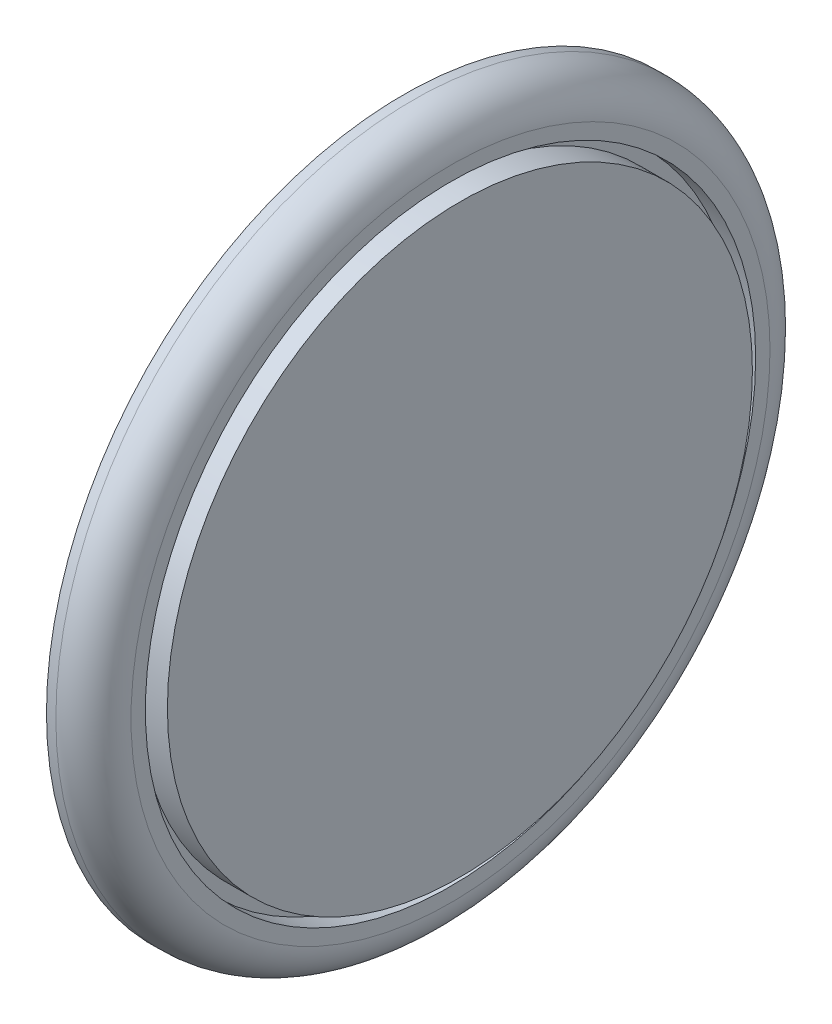
ISO-10303-21;
HEADER;
FILE_DESCRIPTION(('STEP AP214'),'2;1');
FILE_NAME('part.step','',(''),(''),'','','');
FILE_SCHEMA(('AUTOMOTIVE_DESIGN { 1 0 10303 214 1 1 1 1 }'));
ENDSEC;
DATA;
#1=APPLICATION_CONTEXT('core data for automotive mechanical design processes');
#2=APPLICATION_PROTOCOL_DEFINITION('international standard','automotive_design',2000,#1);
#3=PRODUCT_CONTEXT('',#1,'mechanical');
#4=PRODUCT('Part','Part','',(#3));
#5=PRODUCT_RELATED_PRODUCT_CATEGORY('part','',(#4));
#6=PRODUCT_DEFINITION_FORMATION('','',#4);
#7=PRODUCT_DEFINITION_CONTEXT('part definition',#1,'design');
#8=PRODUCT_DEFINITION('design','',#6,#7);
#9=PRODUCT_DEFINITION_SHAPE('','',#8);
#10=(LENGTH_UNIT() NAMED_UNIT(*) SI_UNIT(.MILLI.,.METRE.));
#11=(NAMED_UNIT(*) PLANE_ANGLE_UNIT() SI_UNIT($,.RADIAN.));
#12=(NAMED_UNIT(*) SI_UNIT($,.STERADIAN.) SOLID_ANGLE_UNIT());
#13=UNCERTAINTY_MEASURE_WITH_UNIT(LENGTH_MEASURE(1.E-05),#10,'distance_accuracy_value','');
#14=(GEOMETRIC_REPRESENTATION_CONTEXT(3) GLOBAL_UNCERTAINTY_ASSIGNED_CONTEXT((#13)) GLOBAL_UNIT_ASSIGNED_CONTEXT((#10,
#11,#12)) REPRESENTATION_CONTEXT('',''));
#15=CARTESIAN_POINT('',(0.,0.,0.));
#16=DIRECTION('',(0.,0.,1.));
#17=DIRECTION('',(1.,0.,0.));
#18=AXIS2_PLACEMENT_3D('',#15,#16,#17);
#19=CARTESIAN_POINT('',(5.,0.,0.));
#20=DIRECTION('',(-1.,0.,0.));
#21=DIRECTION('',(0.,0.,1.));
#22=AXIS2_PLACEMENT_3D('',#19,#20,#21);
#23=CYLINDRICAL_SURFACE('',#22,38.);
#24=CARTESIAN_POINT('',(1.,0.,0.));
#25=DIRECTION('',(1.,0.,0.));
#26=DIRECTION('',(0.,0.,-1.));
#27=AXIS2_PLACEMENT_3D('',#24,#25,#26);
#28=CIRCLE('',#27,38.);
#29=CARTESIAN_POINT('',(1.,0.,-38.));
#30=VERTEX_POINT('',#29);
#31=EDGE_CURVE('E64',#30,#30,#28,.F.);
#32=ORIENTED_EDGE('',*,*,#31,.T.);
#33=EDGE_LOOP('',(#32));
#34=FACE_BOUND('',#33,.T.);
#35=CARTESIAN_POINT('',(0.,0.,0.));
#36=DIRECTION('',(1.,0.,0.));
#37=DIRECTION('',(0.,0.,-1.));
#38=AXIS2_PLACEMENT_3D('',#35,#36,#37);
#39=CIRCLE('',#38,38.);
#40=CARTESIAN_POINT('',(0.,0.,-38.));
#41=VERTEX_POINT('',#40);
#42=EDGE_CURVE('E70',#41,#41,#39,.T.);
#43=ORIENTED_EDGE('',*,*,#42,.T.);
#44=EDGE_LOOP('',(#43));
#45=FACE_BOUND('',#44,.T.);
#46=ADVANCED_FACE('F41',(#34,#45),#23,.T.);
#47=CARTESIAN_POINT('',(5.,0.,0.));
#48=DIRECTION('',(1.,0.,0.));
#49=DIRECTION('',(0.,0.,-1.));
#50=AXIS2_PLACEMENT_3D('',#47,#48,#49);
#51=PLANE('',#50);
#52=CARTESIAN_POINT('',(5.,0.,0.));
#53=DIRECTION('',(1.,0.,0.));
#54=DIRECTION('',(0.,0.,-1.));
#55=AXIS2_PLACEMENT_3D('',#52,#53,#54);
#56=CIRCLE('',#55,32.4744734252896);
#57=CARTESIAN_POINT('',(5.,0.,-32.4744734252896));
#58=VERTEX_POINT('',#57);
#59=EDGE_CURVE('E89',#58,#58,#56,.T.);
#60=ORIENTED_EDGE('',*,*,#59,.F.);
#61=EDGE_LOOP('',(#60));
#62=FACE_BOUND('',#61,.T.);
#63=CARTESIAN_POINT('',(5.,0.,0.));
#64=DIRECTION('',(1.,0.,0.));
#65=DIRECTION('',(0.,0.,-1.));
#66=AXIS2_PLACEMENT_3D('',#63,#64,#65);
#67=CIRCLE('',#66,34.);
#68=CARTESIAN_POINT('',(5.,0.,-34.));
#69=VERTEX_POINT('',#68);
#70=EDGE_CURVE('E67',#69,#69,#67,.T.);
#71=ORIENTED_EDGE('',*,*,#70,.T.);
#72=EDGE_LOOP('',(#71));
#73=FACE_BOUND('',#72,.T.);
#74=ADVANCED_FACE('F135',(#62,#73),#51,.T.);
#75=CARTESIAN_POINT('',(0.,0.,0.));
#76=DIRECTION('',(1.,0.,0.));
#77=DIRECTION('',(0.,0.,-1.));
#78=AXIS2_PLACEMENT_3D('',#75,#76,#77);
#79=PLANE('',#78);
#80=CARTESIAN_POINT('',(0.,0.,0.));
#81=DIRECTION('',(-1.,0.,0.));
#82=DIRECTION('',(0.,0.,1.));
#83=AXIS2_PLACEMENT_3D('',#80,#81,#82);
#84=CIRCLE('',#83,35.1916978171089);
#85=CARTESIAN_POINT('',(0.,0.,35.1916978171089));
#86=VERTEX_POINT('',#85);
#87=EDGE_CURVE('E95',#86,#86,#84,.T.);
#88=ORIENTED_EDGE('',*,*,#87,.F.);
#89=EDGE_LOOP('',(#88));
#90=FACE_BOUND('',#89,.T.);
#91=ORIENTED_EDGE('',*,*,#42,.F.);
#92=EDGE_LOOP('',(#91));
#93=FACE_BOUND('',#92,.T.);
#94=ADVANCED_FACE('F138',(#90,#93),#79,.F.);
#95=CARTESIAN_POINT('',(1.,0.,0.));
#96=DIRECTION('',(1.,0.,0.));
#97=DIRECTION('',(0.,0.,-1.));
#98=AXIS2_PLACEMENT_3D('',#95,#96,#97);
#99=TOROIDAL_SURFACE('',#98,34.,4.);
#100=ORIENTED_EDGE('',*,*,#31,.F.);
#101=EDGE_LOOP('',(#100));
#102=FACE_BOUND('',#101,.T.);
#103=ORIENTED_EDGE('',*,*,#70,.F.);
#104=EDGE_LOOP('',(#103));
#105=FACE_BOUND('',#104,.T.);
#106=ADVANCED_FACE('F43',(#102,#105),#99,.T.);
#107=CARTESIAN_POINT('',(3.,0.,0.));
#108=DIRECTION('',(1.,0.,0.));
#109=DIRECTION('',(0.,0.,-1.));
#110=AXIS2_PLACEMENT_3D('',#107,#108,#109);
#111=CYLINDRICAL_SURFACE('',#110,32.4744734252896);
#112=CARTESIAN_POINT('',(3.,0.,0.));
#113=DIRECTION('',(1.,0.,0.));
#114=DIRECTION('',(0.,0.,-1.));
#115=AXIS2_PLACEMENT_3D('',#112,#113,#114);
#116=CIRCLE('',#115,32.4744734252896);
#117=CARTESIAN_POINT('',(3.,0.,-32.4744734252896));
#118=VERTEX_POINT('',#117);
#119=EDGE_CURVE('E88',#118,#118,#116,.T.);
#120=ORIENTED_EDGE('',*,*,#119,.F.);
#121=EDGE_LOOP('',(#120));
#122=FACE_BOUND('',#121,.T.);
#123=ORIENTED_EDGE('',*,*,#59,.T.);
#124=EDGE_LOOP('',(#123));
#125=FACE_BOUND('',#124,.T.);
#126=ADVANCED_FACE('F126',(#122,#125),#111,.F.);
#127=CARTESIAN_POINT('',(3.,0.,0.));
#128=DIRECTION('',(1.,0.,0.));
#129=DIRECTION('',(0.,0.,-1.));
#130=AXIS2_PLACEMENT_3D('',#127,#128,#129);
#131=PLANE('',#130);
#132=CARTESIAN_POINT('',(3.,0.,0.));
#133=DIRECTION('',(1.,0.,0.));
#134=DIRECTION('',(0.,0.,-1.));
#135=AXIS2_PLACEMENT_3D('',#132,#133,#134);
#136=CIRCLE('',#135,31.1285855775368);
#137=CARTESIAN_POINT('',(3.,0.,-31.1285855775368));
#138=VERTEX_POINT('',#137);
#139=EDGE_CURVE('E107',#138,#138,#136,.T.);
#140=ORIENTED_EDGE('',*,*,#139,.F.);
#141=EDGE_LOOP('',(#140));
#142=FACE_BOUND('',#141,.T.);
#143=ORIENTED_EDGE('',*,*,#119,.T.);
#144=EDGE_LOOP('',(#143));
#145=FACE_BOUND('',#144,.T.);
#146=ADVANCED_FACE('F122',(#142,#145),#131,.T.);
#147=CARTESIAN_POINT('',(2.,0.,0.));
#148=DIRECTION('',(-1.,0.,0.));
#149=DIRECTION('',(0.,0.,1.));
#150=AXIS2_PLACEMENT_3D('',#147,#148,#149);
#151=CYLINDRICAL_SURFACE('',#150,35.1916978171089);
#152=CARTESIAN_POINT('',(2.,0.,0.));
#153=DIRECTION('',(-1.,0.,0.));
#154=DIRECTION('',(0.,0.,1.));
#155=AXIS2_PLACEMENT_3D('',#152,#153,#154);
#156=CIRCLE('',#155,35.1916978171089);
#157=CARTESIAN_POINT('',(2.,0.,35.1916978171089));
#158=VERTEX_POINT('',#157);
#159=EDGE_CURVE('E92',#158,#158,#156,.T.);
#160=ORIENTED_EDGE('',*,*,#159,.F.);
#161=EDGE_LOOP('',(#160));
#162=FACE_BOUND('',#161,.T.);
#163=ORIENTED_EDGE('',*,*,#87,.T.);
#164=EDGE_LOOP('',(#163));
#165=FACE_BOUND('',#164,.T.);
#166=ADVANCED_FACE('F125',(#162,#165),#151,.F.);
#167=CARTESIAN_POINT('',(2.,0.,0.));
#168=DIRECTION('',(-1.,0.,0.));
#169=DIRECTION('',(0.,0.,1.));
#170=AXIS2_PLACEMENT_3D('',#167,#168,#169);
#171=PLANE('',#170);
#172=CARTESIAN_POINT('',(2.,0.,0.));
#173=DIRECTION('',(-1.,0.,0.));
#174=DIRECTION('',(0.,0.,1.));
#175=AXIS2_PLACEMENT_3D('',#172,#173,#174);
#176=CIRCLE('',#175,32.740433986256);
#177=CARTESIAN_POINT('',(2.,0.,32.740433986256));
#178=VERTEX_POINT('',#177);
#179=EDGE_CURVE('E98',#178,#178,#176,.T.);
#180=ORIENTED_EDGE('',*,*,#179,.F.);
#181=EDGE_LOOP('',(#180));
#182=FACE_BOUND('',#181,.T.);
#183=ORIENTED_EDGE('',*,*,#159,.T.);
#184=EDGE_LOOP('',(#183));
#185=FACE_BOUND('',#184,.T.);
#186=ADVANCED_FACE('F200',(#182,#185),#171,.T.);
#187=CARTESIAN_POINT('',(2.,0.,0.));
#188=DIRECTION('',(-1.,0.,0.));
#189=DIRECTION('',(0.,0.,1.));
#190=AXIS2_PLACEMENT_3D('',#187,#188,#189);
#191=CYLINDRICAL_SURFACE('',#190,32.740433986256);
#192=ORIENTED_EDGE('',*,*,#179,.T.);
#193=EDGE_LOOP('',(#192));
#194=FACE_BOUND('',#193,.T.);
#195=CARTESIAN_POINT('',(0.,0.,0.));
#196=DIRECTION('',(-1.,0.,0.));
#197=DIRECTION('',(0.,0.,1.));
#198=AXIS2_PLACEMENT_3D('',#195,#196,#197);
#199=CIRCLE('',#198,32.740433986256);
#200=CARTESIAN_POINT('',(0.,0.,32.740433986256));
#201=VERTEX_POINT('',#200);
#202=EDGE_CURVE('E101',#201,#201,#199,.T.);
#203=ORIENTED_EDGE('',*,*,#202,.F.);
#204=EDGE_LOOP('',(#203));
#205=FACE_BOUND('',#204,.T.);
#206=ADVANCED_FACE('F195',(#194,#205),#191,.T.);
#207=CARTESIAN_POINT('',(-2.3,-16.29,0.));
#208=DIRECTION('',(1.,0.,0.));
#209=DIRECTION('',(0.,0.,-1.));
#210=AXIS2_PLACEMENT_3D('',#207,#208,#209);
#211=PLANE('',#210);
#212=CARTESIAN_POINT('',(-2.3,-16.29,0.));
#213=DIRECTION('',(-1.,0.,0.));
#214=DIRECTION('',(0.,0.,-1.));
#215=AXIS2_PLACEMENT_3D('',#212,#213,#214);
#216=CIRCLE('',#215,2.);
#217=CARTESIAN_POINT('',(-2.3,-16.29,-2.));
#218=VERTEX_POINT('',#217);
#219=EDGE_CURVE('E85',#218,#218,#216,.T.);
#220=ORIENTED_EDGE('',*,*,#219,.T.);
#221=EDGE_LOOP('',(#220));
#222=FACE_BOUND('',#221,.T.);
#223=ADVANCED_FACE('F189',(#222),#211,.F.);
#224=CARTESIAN_POINT('',(-2.3,0.,-16.29));
#225=DIRECTION('',(1.,0.,0.));
#226=DIRECTION('',(0.,0.,-1.));
#227=AXIS2_PLACEMENT_3D('',#224,#225,#226);
#228=PLANE('',#227);
#229=CARTESIAN_POINT('',(-2.3,0.,-16.29));
#230=DIRECTION('',(-1.,0.,0.));
#231=DIRECTION('',(0.,0.,-1.));
#232=AXIS2_PLACEMENT_3D('',#229,#230,#231);
#233=CIRCLE('',#232,2.);
#234=CARTESIAN_POINT('',(-2.3,0.,-18.29));
#235=VERTEX_POINT('',#234);
#236=EDGE_CURVE('E82',#235,#235,#233,.T.);
#237=ORIENTED_EDGE('',*,*,#236,.T.);
#238=EDGE_LOOP('',(#237));
#239=FACE_BOUND('',#238,.T.);
#240=ADVANCED_FACE('F182',(#239),#228,.F.);
#241=CARTESIAN_POINT('',(-2.3,16.29,0.));
#242=DIRECTION('',(-1.,0.,0.));
#243=DIRECTION('',(0.,0.,1.));
#244=AXIS2_PLACEMENT_3D('',#241,#242,#243);
#245=PLANE('',#244);
#246=CARTESIAN_POINT('',(-2.3,16.29,0.));
#247=DIRECTION('',(-1.,0.,0.));
#248=DIRECTION('',(0.,0.,1.));
#249=AXIS2_PLACEMENT_3D('',#246,#247,#248);
#250=CIRCLE('',#249,2.);
#251=CARTESIAN_POINT('',(-2.3,16.29,2.));
#252=VERTEX_POINT('',#251);
#253=EDGE_CURVE('E79',#252,#252,#250,.T.);
#254=ORIENTED_EDGE('',*,*,#253,.T.);
#255=EDGE_LOOP('',(#254));
#256=FACE_BOUND('',#255,.T.);
#257=ADVANCED_FACE('F174',(#256),#245,.T.);
#258=CARTESIAN_POINT('',(-2.3,0.,16.29));
#259=DIRECTION('',(-1.,0.,0.));
#260=DIRECTION('',(0.,0.,1.));
#261=AXIS2_PLACEMENT_3D('',#258,#259,#260);
#262=PLANE('',#261);
#263=CARTESIAN_POINT('',(-2.3,0.,16.29));
#264=DIRECTION('',(-1.,0.,0.));
#265=DIRECTION('',(0.,0.,1.));
#266=AXIS2_PLACEMENT_3D('',#263,#264,#265);
#267=CIRCLE('',#266,2.);
#268=CARTESIAN_POINT('',(-2.3,0.,18.29));
#269=VERTEX_POINT('',#268);
#270=EDGE_CURVE('E76',#269,#269,#267,.T.);
#271=ORIENTED_EDGE('',*,*,#270,.T.);
#272=EDGE_LOOP('',(#271));
#273=FACE_BOUND('',#272,.T.);
#274=ADVANCED_FACE('F166',(#273),#262,.T.);
#275=CARTESIAN_POINT('',(-2.3,0.,0.));
#276=DIRECTION('',(-1.,0.,0.));
#277=DIRECTION('',(0.,0.,1.));
#278=AXIS2_PLACEMENT_3D('',#275,#276,#277);
#279=PLANE('',#278);
#280=CARTESIAN_POINT('',(-2.3,0.,0.));
#281=DIRECTION('',(-1.,0.,0.));
#282=DIRECTION('',(0.,0.,1.));
#283=AXIS2_PLACEMENT_3D('',#280,#281,#282);
#284=CIRCLE('',#283,2.);
#285=CARTESIAN_POINT('',(-2.3,0.,2.));
#286=VERTEX_POINT('',#285);
#287=EDGE_CURVE('E73',#286,#286,#284,.T.);
#288=ORIENTED_EDGE('',*,*,#287,.T.);
#289=EDGE_LOOP('',(#288));
#290=FACE_BOUND('',#289,.T.);
#291=ADVANCED_FACE('F162',(#290),#279,.T.);
#292=CARTESIAN_POINT('',(-2.3,-16.29,0.));
#293=DIRECTION('',(1.,0.,0.));
#294=DIRECTION('',(0.,0.,-1.));
#295=AXIS2_PLACEMENT_3D('',#292,#293,#294);
#296=CYLINDRICAL_SURFACE('',#295,2.);
#297=ORIENTED_EDGE('',*,*,#219,.F.);
#298=EDGE_LOOP('',(#297));
#299=FACE_BOUND('',#298,.T.);
#300=CARTESIAN_POINT('',(0.,-16.29,0.));
#301=DIRECTION('',(1.,0.,0.));
#302=DIRECTION('',(0.,0.,-1.));
#303=AXIS2_PLACEMENT_3D('',#300,#301,#302);
#304=CIRCLE('',#303,2.);
#305=CARTESIAN_POINT('',(0.,-16.29,-2.));
#306=VERTEX_POINT('',#305);
#307=EDGE_CURVE('E10',#306,#306,#304,.F.);
#308=ORIENTED_EDGE('',*,*,#307,.T.);
#309=EDGE_LOOP('',(#308));
#310=FACE_BOUND('',#309,.T.);
#311=ADVANCED_FACE('F165',(#299,#310),#296,.T.);
#312=CARTESIAN_POINT('',(-2.3,0.,-16.29));
#313=DIRECTION('',(1.,0.,0.));
#314=DIRECTION('',(0.,0.,-1.));
#315=AXIS2_PLACEMENT_3D('',#312,#313,#314);
#316=CYLINDRICAL_SURFACE('',#315,2.);
#317=ORIENTED_EDGE('',*,*,#236,.F.);
#318=EDGE_LOOP('',(#317));
#319=FACE_BOUND('',#318,.T.);
#320=CARTESIAN_POINT('',(0.,0.,-16.29));
#321=DIRECTION('',(1.,0.,0.));
#322=DIRECTION('',(0.,0.,-1.));
#323=AXIS2_PLACEMENT_3D('',#320,#321,#322);
#324=CIRCLE('',#323,2.);
#325=CARTESIAN_POINT('',(0.,0.,-18.29));
#326=VERTEX_POINT('',#325);
#327=EDGE_CURVE('E48',#326,#326,#324,.F.);
#328=ORIENTED_EDGE('',*,*,#327,.T.);
#329=EDGE_LOOP('',(#328));
#330=FACE_BOUND('',#329,.T.);
#331=ADVANCED_FACE('F178',(#319,#330),#316,.T.);
#332=CARTESIAN_POINT('',(-2.3,16.29,0.));
#333=DIRECTION('',(1.,0.,0.));
#334=DIRECTION('',(0.,0.,-1.));
#335=AXIS2_PLACEMENT_3D('',#332,#333,#334);
#336=CYLINDRICAL_SURFACE('',#335,2.);
#337=ORIENTED_EDGE('',*,*,#253,.F.);
#338=EDGE_LOOP('',(#337));
#339=FACE_BOUND('',#338,.T.);
#340=CARTESIAN_POINT('',(0.,16.29,0.));
#341=DIRECTION('',(1.,0.,0.));
#342=DIRECTION('',(0.,0.,-1.));
#343=AXIS2_PLACEMENT_3D('',#340,#341,#342);
#344=CIRCLE('',#343,2.);
#345=CARTESIAN_POINT('',(0.,16.29,-2.));
#346=VERTEX_POINT('',#345);
#347=EDGE_CURVE('E52',#346,#346,#344,.F.);
#348=ORIENTED_EDGE('',*,*,#347,.T.);
#349=EDGE_LOOP('',(#348));
#350=FACE_BOUND('',#349,.T.);
#351=ADVANCED_FACE('F170',(#339,#350),#336,.T.);
#352=CARTESIAN_POINT('',(-2.3,0.,16.29));
#353=DIRECTION('',(1.,0.,0.));
#354=DIRECTION('',(0.,0.,-1.));
#355=AXIS2_PLACEMENT_3D('',#352,#353,#354);
#356=CYLINDRICAL_SURFACE('',#355,2.);
#357=ORIENTED_EDGE('',*,*,#270,.F.);
#358=EDGE_LOOP('',(#357));
#359=FACE_BOUND('',#358,.T.);
#360=CARTESIAN_POINT('',(0.,0.,16.29));
#361=DIRECTION('',(1.,0.,0.));
#362=DIRECTION('',(0.,0.,-1.));
#363=AXIS2_PLACEMENT_3D('',#360,#361,#362);
#364=CIRCLE('',#363,2.);
#365=CARTESIAN_POINT('',(0.,0.,14.29));
#366=VERTEX_POINT('',#365);
#367=EDGE_CURVE('E56',#366,#366,#364,.F.);
#368=ORIENTED_EDGE('',*,*,#367,.T.);
#369=EDGE_LOOP('',(#368));
#370=FACE_BOUND('',#369,.T.);
#371=ADVANCED_FACE('F160',(#359,#370),#356,.T.);
#372=CARTESIAN_POINT('',(-2.3,0.,0.));
#373=DIRECTION('',(1.,0.,0.));
#374=DIRECTION('',(0.,0.,-1.));
#375=AXIS2_PLACEMENT_3D('',#372,#373,#374);
#376=CYLINDRICAL_SURFACE('',#375,2.);
#377=ORIENTED_EDGE('',*,*,#287,.F.);
#378=EDGE_LOOP('',(#377));
#379=FACE_BOUND('',#378,.T.);
#380=CARTESIAN_POINT('',(0.,0.,0.));
#381=DIRECTION('',(1.,0.,0.));
#382=DIRECTION('',(0.,0.,-1.));
#383=AXIS2_PLACEMENT_3D('',#380,#381,#382);
#384=CIRCLE('',#383,2.);
#385=CARTESIAN_POINT('',(0.,0.,-2.));
#386=VERTEX_POINT('',#385);
#387=EDGE_CURVE('E61',#386,#386,#384,.F.);
#388=ORIENTED_EDGE('',*,*,#387,.T.);
#389=EDGE_LOOP('',(#388));
#390=FACE_BOUND('',#389,.T.);
#391=ADVANCED_FACE('F157',(#379,#390),#376,.T.);
#392=ORIENTED_EDGE('',*,*,#387,.F.);
#393=EDGE_LOOP('',(#392));
#394=FACE_BOUND('',#393,.T.);
#395=ORIENTED_EDGE('',*,*,#367,.F.);
#396=EDGE_LOOP('',(#395));
#397=FACE_BOUND('',#396,.T.);
#398=ORIENTED_EDGE('',*,*,#347,.F.);
#399=EDGE_LOOP('',(#398));
#400=FACE_BOUND('',#399,.T.);
#401=ORIENTED_EDGE('',*,*,#327,.F.);
#402=EDGE_LOOP('',(#401));
#403=FACE_BOUND('',#402,.T.);
#404=ORIENTED_EDGE('',*,*,#307,.F.);
#405=EDGE_LOOP('',(#404));
#406=FACE_BOUND('',#405,.T.);
#407=ORIENTED_EDGE('',*,*,#202,.T.);
#408=EDGE_LOOP('',(#407));
#409=FACE_BOUND('',#408,.T.);
#410=ADVANCED_FACE('F118',(#394,#397,#400,#403,#406,#409),#79,.F.);
#411=CARTESIAN_POINT('',(6.,0.,0.));
#412=DIRECTION('',(-1.,0.,0.));
#413=DIRECTION('',(0.,0.,1.));
#414=AXIS2_PLACEMENT_3D('',#411,#412,#413);
#415=CYLINDRICAL_SURFACE('',#414,31.1285855775368);
#416=CARTESIAN_POINT('',(6.,0.,0.));
#417=DIRECTION('',(1.,0.,0.));
#418=DIRECTION('',(0.,0.,-1.));
#419=AXIS2_PLACEMENT_3D('',#416,#417,#418);
#420=CIRCLE('',#419,31.1285855775368);
#421=CARTESIAN_POINT('',(6.,0.,-31.1285855775368));
#422=VERTEX_POINT('',#421);
#423=EDGE_CURVE('E104',#422,#422,#420,.T.);
#424=ORIENTED_EDGE('',*,*,#423,.F.);
#425=EDGE_LOOP('',(#424));
#426=FACE_BOUND('',#425,.T.);
#427=ORIENTED_EDGE('',*,*,#139,.T.);
#428=EDGE_LOOP('',(#427));
#429=FACE_BOUND('',#428,.T.);
#430=ADVANCED_FACE('F115',(#426,#429),#415,.T.);
#431=CARTESIAN_POINT('',(6.,0.,0.));
#432=DIRECTION('',(1.,0.,0.));
#433=DIRECTION('',(0.,0.,-1.));
#434=AXIS2_PLACEMENT_3D('',#431,#432,#433);
#435=PLANE('',#434);
#436=ORIENTED_EDGE('',*,*,#423,.T.);
#437=EDGE_LOOP('',(#436));
#438=FACE_BOUND('',#437,.T.);
#439=ADVANCED_FACE('F113',(#438),#435,.T.);
#440=CLOSED_SHELL('',(#46,#74,#94,#106,#126,#146,#166,#186,#206,#223,#240,#257,#274,#291,#311,
#331,#351,#371,#391,#410,#430,#439));
#441=MANIFOLD_SOLID_BREP('B2',#440);
#442=ADVANCED_BREP_SHAPE_REPRESENTATION('',(#18,#441),#14);
#443=SHAPE_DEFINITION_REPRESENTATION(#9,#442);
ENDSEC;
END-ISO-10303-21;
